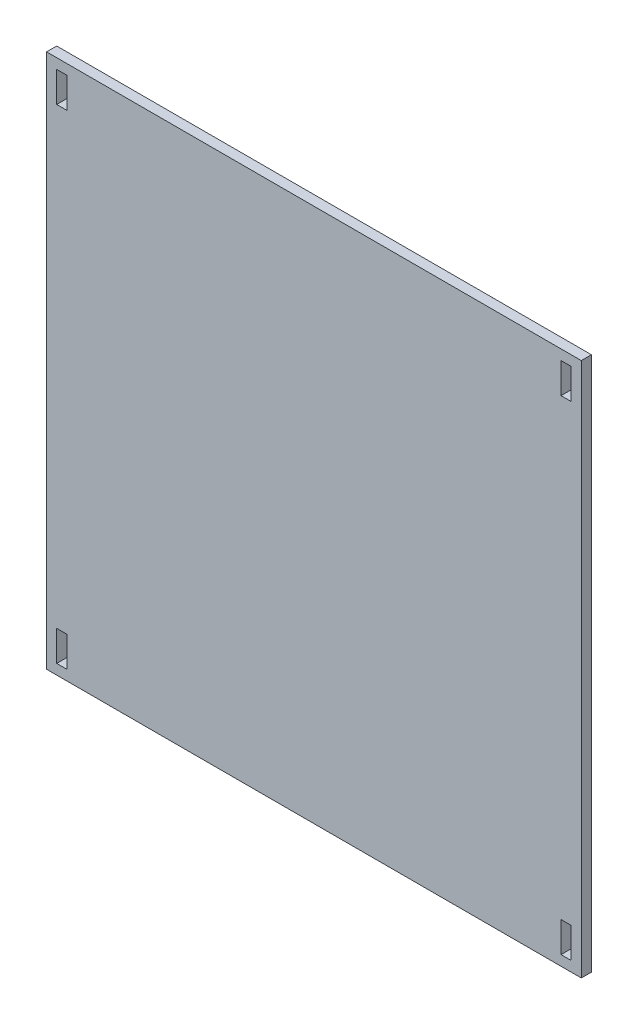
ISO-10303-21;
HEADER;
FILE_DESCRIPTION(('STEP AP214'),'2;1');
FILE_NAME('part.step','',(''),(''),'','','');
FILE_SCHEMA(('AUTOMOTIVE_DESIGN { 1 0 10303 214 1 1 1 1 }'));
ENDSEC;
DATA;
#1=APPLICATION_CONTEXT('core data for automotive mechanical design processes');
#2=APPLICATION_PROTOCOL_DEFINITION('international standard','automotive_design',2000,#1);
#3=PRODUCT_CONTEXT('',#1,'mechanical');
#4=PRODUCT('Part','Part','',(#3));
#5=PRODUCT_RELATED_PRODUCT_CATEGORY('part','',(#4));
#6=PRODUCT_DEFINITION_FORMATION('','',#4);
#7=PRODUCT_DEFINITION_CONTEXT('part definition',#1,'design');
#8=PRODUCT_DEFINITION('design','',#6,#7);
#9=PRODUCT_DEFINITION_SHAPE('','',#8);
#10=(LENGTH_UNIT() NAMED_UNIT(*) SI_UNIT(.MILLI.,.METRE.));
#11=(NAMED_UNIT(*) PLANE_ANGLE_UNIT() SI_UNIT($,.RADIAN.));
#12=(NAMED_UNIT(*) SI_UNIT($,.STERADIAN.) SOLID_ANGLE_UNIT());
#13=UNCERTAINTY_MEASURE_WITH_UNIT(LENGTH_MEASURE(1.E-05),#10,'distance_accuracy_value','');
#14=(GEOMETRIC_REPRESENTATION_CONTEXT(3) GLOBAL_UNCERTAINTY_ASSIGNED_CONTEXT((#13)) GLOBAL_UNIT_ASSIGNED_CONTEXT((#10,
#11,#12)) REPRESENTATION_CONTEXT('',''));
#15=CARTESIAN_POINT('',(0.,0.,0.));
#16=DIRECTION('',(0.,0.,1.));
#17=DIRECTION('',(1.,0.,0.));
#18=AXIS2_PLACEMENT_3D('',#15,#16,#17);
#19=CARTESIAN_POINT('',(0.,0.,10.));
#20=DIRECTION('',(-1.,0.,0.));
#21=DIRECTION('',(0.,0.,1.));
#22=AXIS2_PLACEMENT_3D('',#19,#20,#21);
#23=PLANE('',#22);
#24=DIRECTION('',(0.,1.,0.));
#25=VECTOR('',#24,1.);
#26=CARTESIAN_POINT('',(0.,0.,0.));
#27=LINE('',#26,#25);
#28=CARTESIAN_POINT('',(0.,0.,0.));
#29=VERTEX_POINT('',#28);
#30=CARTESIAN_POINT('',(0.,528.,0.));
#31=VERTEX_POINT('',#30);
#32=EDGE_CURVE('E298',#29,#31,#27,.T.);
#33=ORIENTED_EDGE('',*,*,#32,.T.);
#34=DIRECTION('',(0.,0.,-1.));
#35=VECTOR('',#34,1.);
#36=CARTESIAN_POINT('',(0.,528.,10.));
#37=LINE('',#36,#35);
#38=CARTESIAN_POINT('',(0.,528.,10.));
#39=VERTEX_POINT('',#38);
#40=EDGE_CURVE('E11',#39,#31,#37,.T.);
#41=ORIENTED_EDGE('',*,*,#40,.F.);
#42=DIRECTION('',(0.,1.,0.));
#43=VECTOR('',#42,1.);
#44=CARTESIAN_POINT('',(0.,0.,10.));
#45=LINE('',#44,#43);
#46=CARTESIAN_POINT('',(0.,0.,10.));
#47=VERTEX_POINT('',#46);
#48=EDGE_CURVE('E305',#47,#39,#45,.T.);
#49=ORIENTED_EDGE('',*,*,#48,.F.);
#50=DIRECTION('',(0.,0.,-1.));
#51=VECTOR('',#50,1.);
#52=CARTESIAN_POINT('',(0.,0.,10.));
#53=LINE('',#52,#51);
#54=EDGE_CURVE('E315',#47,#29,#53,.T.);
#55=ORIENTED_EDGE('',*,*,#54,.T.);
#56=EDGE_LOOP('',(#33,#41,#49,#55));
#57=FACE_BOUND('',#56,.T.);
#58=ADVANCED_FACE('F33',(#57),#23,.F.);
#59=CARTESIAN_POINT('',(0.,528.,10.));
#60=DIRECTION('',(0.,-1.,0.));
#61=DIRECTION('',(1.,0.,0.));
#62=AXIS2_PLACEMENT_3D('',#59,#60,#61);
#63=PLANE('',#62);
#64=DIRECTION('',(-1.,0.,0.));
#65=VECTOR('',#64,1.);
#66=CARTESIAN_POINT('',(0.,528.,0.));
#67=LINE('',#66,#65);
#68=CARTESIAN_POINT('',(-528.,528.,0.));
#69=VERTEX_POINT('',#68);
#70=EDGE_CURVE('E318',#31,#69,#67,.T.);
#71=ORIENTED_EDGE('',*,*,#70,.T.);
#72=DIRECTION('',(0.,0.,-1.));
#73=VECTOR('',#72,1.);
#74=CARTESIAN_POINT('',(-528.,528.,10.));
#75=LINE('',#74,#73);
#76=CARTESIAN_POINT('',(-528.,528.,10.));
#77=VERTEX_POINT('',#76);
#78=EDGE_CURVE('E40',#77,#69,#75,.T.);
#79=ORIENTED_EDGE('',*,*,#78,.F.);
#80=DIRECTION('',(-1.,0.,0.));
#81=VECTOR('',#80,1.);
#82=CARTESIAN_POINT('',(0.,528.,10.));
#83=LINE('',#82,#81);
#84=EDGE_CURVE('E308',#39,#77,#83,.T.);
#85=ORIENTED_EDGE('',*,*,#84,.F.);
#86=ORIENTED_EDGE('',*,*,#40,.T.);
#87=EDGE_LOOP('',(#71,#79,#85,#86));
#88=FACE_BOUND('',#87,.T.);
#89=ADVANCED_FACE('F347',(#88),#63,.F.);
#90=CARTESIAN_POINT('',(-528.,0.,10.));
#91=DIRECTION('',(1.,0.,0.));
#92=DIRECTION('',(0.,0.,-1.));
#93=AXIS2_PLACEMENT_3D('',#90,#91,#92);
#94=PLANE('',#93);
#95=DIRECTION('',(0.,-1.,0.));
#96=VECTOR('',#95,1.);
#97=CARTESIAN_POINT('',(-528.,0.,0.));
#98=LINE('',#97,#96);
#99=CARTESIAN_POINT('',(-528.,0.,0.));
#100=VERTEX_POINT('',#99);
#101=EDGE_CURVE('E320',#69,#100,#98,.T.);
#102=ORIENTED_EDGE('',*,*,#101,.T.);
#103=DIRECTION('',(0.,0.,-1.));
#104=VECTOR('',#103,1.);
#105=CARTESIAN_POINT('',(-528.,0.,10.));
#106=LINE('',#105,#104);
#107=CARTESIAN_POINT('',(-528.,0.,10.));
#108=VERTEX_POINT('',#107);
#109=EDGE_CURVE('E325',#108,#100,#106,.T.);
#110=ORIENTED_EDGE('',*,*,#109,.F.);
#111=DIRECTION('',(0.,-1.,0.));
#112=VECTOR('',#111,1.);
#113=CARTESIAN_POINT('',(-528.,0.,10.));
#114=LINE('',#113,#112);
#115=EDGE_CURVE('E311',#77,#108,#114,.T.);
#116=ORIENTED_EDGE('',*,*,#115,.F.);
#117=ORIENTED_EDGE('',*,*,#78,.T.);
#118=EDGE_LOOP('',(#102,#110,#116,#117));
#119=FACE_BOUND('',#118,.T.);
#120=ADVANCED_FACE('F332',(#119),#94,.F.);
#121=CARTESIAN_POINT('',(0.,0.,10.));
#122=DIRECTION('',(0.,1.,0.));
#123=DIRECTION('',(0.,0.,1.));
#124=AXIS2_PLACEMENT_3D('',#121,#122,#123);
#125=PLANE('',#124);
#126=DIRECTION('',(1.,0.,0.));
#127=VECTOR('',#126,1.);
#128=CARTESIAN_POINT('',(0.,0.,0.));
#129=LINE('',#128,#127);
#130=EDGE_CURVE('E309',#100,#29,#129,.T.);
#131=ORIENTED_EDGE('',*,*,#130,.T.);
#132=ORIENTED_EDGE('',*,*,#54,.F.);
#133=DIRECTION('',(1.,0.,0.));
#134=VECTOR('',#133,1.);
#135=CARTESIAN_POINT('',(0.,0.,10.));
#136=LINE('',#135,#134);
#137=EDGE_CURVE('E313',#108,#47,#136,.T.);
#138=ORIENTED_EDGE('',*,*,#137,.F.);
#139=ORIENTED_EDGE('',*,*,#109,.T.);
#140=EDGE_LOOP('',(#131,#132,#138,#139));
#141=FACE_BOUND('',#140,.T.);
#142=ADVANCED_FACE('F341',(#141),#125,.F.);
#143=CARTESIAN_POINT('',(0.,0.,10.));
#144=DIRECTION('',(0.,0.,1.));
#145=DIRECTION('',(1.,0.,0.));
#146=AXIS2_PLACEMENT_3D('',#143,#144,#145);
#147=PLANE('',#146);
#148=DIRECTION('',(0.,-1.,0.));
#149=VECTOR('',#148,1.);
#150=CARTESIAN_POINT('',(-10.,518.,10.));
#151=LINE('',#150,#149);
#152=CARTESIAN_POINT('',(-10.,518.,10.));
#153=VERTEX_POINT('',#152);
#154=CARTESIAN_POINT('',(-10.,488.,10.));
#155=VERTEX_POINT('',#154);
#156=EDGE_CURVE('E244',#153,#155,#151,.T.);
#157=ORIENTED_EDGE('',*,*,#156,.T.);
#158=DIRECTION('',(-1.,0.,0.));
#159=VECTOR('',#158,1.);
#160=CARTESIAN_POINT('',(-10.,488.,10.));
#161=LINE('',#160,#159);
#162=CARTESIAN_POINT('',(-20.,488.,10.));
#163=VERTEX_POINT('',#162);
#164=EDGE_CURVE('E247',#155,#163,#161,.T.);
#165=ORIENTED_EDGE('',*,*,#164,.T.);
#166=DIRECTION('',(0.,1.,0.));
#167=VECTOR('',#166,1.);
#168=CARTESIAN_POINT('',(-20.,518.,10.));
#169=LINE('',#168,#167);
#170=CARTESIAN_POINT('',(-20.,518.,10.));
#171=VERTEX_POINT('',#170);
#172=EDGE_CURVE('E47',#163,#171,#169,.T.);
#173=ORIENTED_EDGE('',*,*,#172,.T.);
#174=DIRECTION('',(1.,0.,0.));
#175=VECTOR('',#174,1.);
#176=CARTESIAN_POINT('',(-10.,518.,10.));
#177=LINE('',#176,#175);
#178=EDGE_CURVE('E252',#171,#153,#177,.T.);
#179=ORIENTED_EDGE('',*,*,#178,.T.);
#180=EDGE_LOOP('',(#157,#165,#173,#179));
#181=FACE_BOUND('',#180,.T.);
#182=DIRECTION('',(0.,-1.,0.));
#183=VECTOR('',#182,1.);
#184=CARTESIAN_POINT('',(-10.,10.,10.));
#185=LINE('',#184,#183);
#186=CARTESIAN_POINT('',(-10.,40.,10.));
#187=VERTEX_POINT('',#186);
#188=CARTESIAN_POINT('',(-10.,10.,10.));
#189=VERTEX_POINT('',#188);
#190=EDGE_CURVE('E214',#187,#189,#185,.T.);
#191=ORIENTED_EDGE('',*,*,#190,.T.);
#192=DIRECTION('',(-1.,0.,0.));
#193=VECTOR('',#192,1.);
#194=CARTESIAN_POINT('',(-10.,10.,10.));
#195=LINE('',#194,#193);
#196=CARTESIAN_POINT('',(-20.,10.,10.));
#197=VERTEX_POINT('',#196);
#198=EDGE_CURVE('E217',#189,#197,#195,.T.);
#199=ORIENTED_EDGE('',*,*,#198,.T.);
#200=DIRECTION('',(0.,1.,0.));
#201=VECTOR('',#200,1.);
#202=CARTESIAN_POINT('',(-20.,10.,10.));
#203=LINE('',#202,#201);
#204=CARTESIAN_POINT('',(-20.,40.,10.));
#205=VERTEX_POINT('',#204);
#206=EDGE_CURVE('E55',#197,#205,#203,.T.);
#207=ORIENTED_EDGE('',*,*,#206,.T.);
#208=DIRECTION('',(1.,0.,0.));
#209=VECTOR('',#208,1.);
#210=CARTESIAN_POINT('',(-10.,40.,10.));
#211=LINE('',#210,#209);
#212=EDGE_CURVE('E222',#205,#187,#211,.T.);
#213=ORIENTED_EDGE('',*,*,#212,.T.);
#214=EDGE_LOOP('',(#191,#199,#207,#213));
#215=FACE_BOUND('',#214,.T.);
#216=DIRECTION('',(0.,1.,0.));
#217=VECTOR('',#216,1.);
#218=CARTESIAN_POINT('',(-518.,40.,10.));
#219=LINE('',#218,#217);
#220=CARTESIAN_POINT('',(-518.,10.,10.));
#221=VERTEX_POINT('',#220);
#222=CARTESIAN_POINT('',(-518.,40.,10.));
#223=VERTEX_POINT('',#222);
#224=EDGE_CURVE('E173',#221,#223,#219,.T.);
#225=ORIENTED_EDGE('',*,*,#224,.T.);
#226=DIRECTION('',(1.,0.,0.));
#227=VECTOR('',#226,1.);
#228=CARTESIAN_POINT('',(-518.,40.,10.));
#229=LINE('',#228,#227);
#230=CARTESIAN_POINT('',(-508.,40.,10.));
#231=VERTEX_POINT('',#230);
#232=EDGE_CURVE('E185',#223,#231,#229,.T.);
#233=ORIENTED_EDGE('',*,*,#232,.T.);
#234=DIRECTION('',(0.,-1.,0.));
#235=VECTOR('',#234,1.);
#236=CARTESIAN_POINT('',(-508.,40.,10.));
#237=LINE('',#236,#235);
#238=CARTESIAN_POINT('',(-508.,10.,10.));
#239=VERTEX_POINT('',#238);
#240=EDGE_CURVE('E189',#231,#239,#237,.T.);
#241=ORIENTED_EDGE('',*,*,#240,.T.);
#242=DIRECTION('',(-1.,0.,0.));
#243=VECTOR('',#242,1.);
#244=CARTESIAN_POINT('',(-518.,10.,10.));
#245=LINE('',#244,#243);
#246=EDGE_CURVE('E181',#239,#221,#245,.T.);
#247=ORIENTED_EDGE('',*,*,#246,.T.);
#248=EDGE_LOOP('',(#225,#233,#241,#247));
#249=FACE_BOUND('',#248,.T.);
#250=DIRECTION('',(0.,1.,0.));
#251=VECTOR('',#250,1.);
#252=CARTESIAN_POINT('',(-518.,518.,10.));
#253=LINE('',#252,#251);
#254=CARTESIAN_POINT('',(-518.,488.,10.));
#255=VERTEX_POINT('',#254);
#256=CARTESIAN_POINT('',(-518.,518.,10.));
#257=VERTEX_POINT('',#256);
#258=EDGE_CURVE('E273',#255,#257,#253,.T.);
#259=ORIENTED_EDGE('',*,*,#258,.T.);
#260=DIRECTION('',(1.,0.,0.));
#261=VECTOR('',#260,1.);
#262=CARTESIAN_POINT('',(-518.,518.,10.));
#263=LINE('',#262,#261);
#264=CARTESIAN_POINT('',(-508.,518.,10.));
#265=VERTEX_POINT('',#264);
#266=EDGE_CURVE('E276',#257,#265,#263,.T.);
#267=ORIENTED_EDGE('',*,*,#266,.T.);
#268=DIRECTION('',(0.,-1.,0.));
#269=VECTOR('',#268,1.);
#270=CARTESIAN_POINT('',(-508.,518.,10.));
#271=LINE('',#270,#269);
#272=CARTESIAN_POINT('',(-508.,488.,10.));
#273=VERTEX_POINT('',#272);
#274=EDGE_CURVE('E280',#265,#273,#271,.T.);
#275=ORIENTED_EDGE('',*,*,#274,.T.);
#276=DIRECTION('',(-1.,0.,0.));
#277=VECTOR('',#276,1.);
#278=CARTESIAN_POINT('',(-518.,488.,10.));
#279=LINE('',#278,#277);
#280=EDGE_CURVE('E283',#273,#255,#279,.T.);
#281=ORIENTED_EDGE('',*,*,#280,.T.);
#282=EDGE_LOOP('',(#259,#267,#275,#281));
#283=FACE_BOUND('',#282,.T.);
#284=ORIENTED_EDGE('',*,*,#48,.T.);
#285=ORIENTED_EDGE('',*,*,#84,.T.);
#286=ORIENTED_EDGE('',*,*,#115,.T.);
#287=ORIENTED_EDGE('',*,*,#137,.T.);
#288=EDGE_LOOP('',(#284,#285,#286,#287));
#289=FACE_BOUND('',#288,.T.);
#290=ADVANCED_FACE('F191',(#181,#215,#249,#283,#289),#147,.T.);
#291=CARTESIAN_POINT('',(0.,0.,0.));
#292=DIRECTION('',(0.,0.,1.));
#293=DIRECTION('',(1.,0.,0.));
#294=AXIS2_PLACEMENT_3D('',#291,#292,#293);
#295=PLANE('',#294);
#296=DIRECTION('',(-1.,0.,0.));
#297=VECTOR('',#296,1.);
#298=CARTESIAN_POINT('',(-10.,488.,0.));
#299=LINE('',#298,#297);
#300=CARTESIAN_POINT('',(-10.,488.,0.));
#301=VERTEX_POINT('',#300);
#302=CARTESIAN_POINT('',(-20.,488.,0.));
#303=VERTEX_POINT('',#302);
#304=EDGE_CURVE('E258',#301,#303,#299,.T.);
#305=ORIENTED_EDGE('',*,*,#304,.F.);
#306=DIRECTION('',(0.,-1.,0.));
#307=VECTOR('',#306,1.);
#308=CARTESIAN_POINT('',(-10.,518.,0.));
#309=LINE('',#308,#307);
#310=CARTESIAN_POINT('',(-10.,518.,0.));
#311=VERTEX_POINT('',#310);
#312=EDGE_CURVE('E256',#311,#301,#309,.T.);
#313=ORIENTED_EDGE('',*,*,#312,.F.);
#314=DIRECTION('',(1.,0.,0.));
#315=VECTOR('',#314,1.);
#316=CARTESIAN_POINT('',(-10.,518.,0.));
#317=LINE('',#316,#315);
#318=CARTESIAN_POINT('',(-20.,518.,0.));
#319=VERTEX_POINT('',#318);
#320=EDGE_CURVE('E248',#319,#311,#317,.T.);
#321=ORIENTED_EDGE('',*,*,#320,.F.);
#322=DIRECTION('',(0.,1.,0.));
#323=VECTOR('',#322,1.);
#324=CARTESIAN_POINT('',(-20.,518.,0.));
#325=LINE('',#324,#323);
#326=EDGE_CURVE('E261',#303,#319,#325,.T.);
#327=ORIENTED_EDGE('',*,*,#326,.F.);
#328=EDGE_LOOP('',(#305,#313,#321,#327));
#329=FACE_BOUND('',#328,.T.);
#330=DIRECTION('',(-1.,0.,0.));
#331=VECTOR('',#330,1.);
#332=CARTESIAN_POINT('',(-10.,10.,0.));
#333=LINE('',#332,#331);
#334=CARTESIAN_POINT('',(-10.,10.,0.));
#335=VERTEX_POINT('',#334);
#336=CARTESIAN_POINT('',(-20.,10.,0.));
#337=VERTEX_POINT('',#336);
#338=EDGE_CURVE('E228',#335,#337,#333,.T.);
#339=ORIENTED_EDGE('',*,*,#338,.F.);
#340=DIRECTION('',(0.,-1.,0.));
#341=VECTOR('',#340,1.);
#342=CARTESIAN_POINT('',(-10.,10.,0.));
#343=LINE('',#342,#341);
#344=CARTESIAN_POINT('',(-10.,40.,0.));
#345=VERTEX_POINT('',#344);
#346=EDGE_CURVE('E226',#345,#335,#343,.T.);
#347=ORIENTED_EDGE('',*,*,#346,.F.);
#348=DIRECTION('',(1.,0.,0.));
#349=VECTOR('',#348,1.);
#350=CARTESIAN_POINT('',(-10.,40.,0.));
#351=LINE('',#350,#349);
#352=CARTESIAN_POINT('',(-20.,40.,0.));
#353=VERTEX_POINT('',#352);
#354=EDGE_CURVE('E218',#353,#345,#351,.T.);
#355=ORIENTED_EDGE('',*,*,#354,.F.);
#356=DIRECTION('',(0.,1.,0.));
#357=VECTOR('',#356,1.);
#358=CARTESIAN_POINT('',(-20.,10.,0.));
#359=LINE('',#358,#357);
#360=EDGE_CURVE('E232',#337,#353,#359,.T.);
#361=ORIENTED_EDGE('',*,*,#360,.F.);
#362=EDGE_LOOP('',(#339,#347,#355,#361));
#363=FACE_BOUND('',#362,.T.);
#364=DIRECTION('',(1.,0.,0.));
#365=VECTOR('',#364,1.);
#366=CARTESIAN_POINT('',(-518.,40.,0.));
#367=LINE('',#366,#365);
#368=CARTESIAN_POINT('',(-518.,40.,0.));
#369=VERTEX_POINT('',#368);
#370=CARTESIAN_POINT('',(-508.,40.,0.));
#371=VERTEX_POINT('',#370);
#372=EDGE_CURVE('E203',#369,#371,#367,.T.);
#373=ORIENTED_EDGE('',*,*,#372,.F.);
#374=DIRECTION('',(0.,1.,0.));
#375=VECTOR('',#374,1.);
#376=CARTESIAN_POINT('',(-518.,40.,0.));
#377=LINE('',#376,#375);
#378=CARTESIAN_POINT('',(-518.,10.,0.));
#379=VERTEX_POINT('',#378);
#380=EDGE_CURVE('E176',#379,#369,#377,.T.);
#381=ORIENTED_EDGE('',*,*,#380,.F.);
#382=DIRECTION('',(-1.,0.,0.));
#383=VECTOR('',#382,1.);
#384=CARTESIAN_POINT('',(-518.,10.,0.));
#385=LINE('',#384,#383);
#386=CARTESIAN_POINT('',(-508.,10.,0.));
#387=VERTEX_POINT('',#386);
#388=EDGE_CURVE('E194',#387,#379,#385,.T.);
#389=ORIENTED_EDGE('',*,*,#388,.F.);
#390=DIRECTION('',(0.,-1.,0.));
#391=VECTOR('',#390,1.);
#392=CARTESIAN_POINT('',(-508.,40.,0.));
#393=LINE('',#392,#391);
#394=EDGE_CURVE('E197',#371,#387,#393,.T.);
#395=ORIENTED_EDGE('',*,*,#394,.F.);
#396=EDGE_LOOP('',(#373,#381,#389,#395));
#397=FACE_BOUND('',#396,.T.);
#398=DIRECTION('',(1.,0.,0.));
#399=VECTOR('',#398,1.);
#400=CARTESIAN_POINT('',(-518.,518.,0.));
#401=LINE('',#400,#399);
#402=CARTESIAN_POINT('',(-518.,518.,0.));
#403=VERTEX_POINT('',#402);
#404=CARTESIAN_POINT('',(-508.,518.,0.));
#405=VERTEX_POINT('',#404);
#406=EDGE_CURVE('E288',#403,#405,#401,.T.);
#407=ORIENTED_EDGE('',*,*,#406,.F.);
#408=DIRECTION('',(0.,1.,0.));
#409=VECTOR('',#408,1.);
#410=CARTESIAN_POINT('',(-518.,518.,0.));
#411=LINE('',#410,#409);
#412=CARTESIAN_POINT('',(-518.,488.,0.));
#413=VERTEX_POINT('',#412);
#414=EDGE_CURVE('E210',#413,#403,#411,.T.);
#415=ORIENTED_EDGE('',*,*,#414,.F.);
#416=DIRECTION('',(-1.,0.,0.));
#417=VECTOR('',#416,1.);
#418=CARTESIAN_POINT('',(-518.,488.,0.));
#419=LINE('',#418,#417);
#420=CARTESIAN_POINT('',(-508.,488.,0.));
#421=VERTEX_POINT('',#420);
#422=EDGE_CURVE('E277',#421,#413,#419,.T.);
#423=ORIENTED_EDGE('',*,*,#422,.F.);
#424=DIRECTION('',(0.,-1.,0.));
#425=VECTOR('',#424,1.);
#426=CARTESIAN_POINT('',(-508.,518.,0.));
#427=LINE('',#426,#425);
#428=EDGE_CURVE('E291',#405,#421,#427,.T.);
#429=ORIENTED_EDGE('',*,*,#428,.F.);
#430=EDGE_LOOP('',(#407,#415,#423,#429));
#431=FACE_BOUND('',#430,.T.);
#432=ORIENTED_EDGE('',*,*,#32,.F.);
#433=ORIENTED_EDGE('',*,*,#130,.F.);
#434=ORIENTED_EDGE('',*,*,#101,.F.);
#435=ORIENTED_EDGE('',*,*,#70,.F.);
#436=EDGE_LOOP('',(#432,#433,#434,#435));
#437=FACE_BOUND('',#436,.T.);
#438=ADVANCED_FACE('F338',(#329,#363,#397,#431,#437),#295,.F.);
#439=CARTESIAN_POINT('',(-518.,518.,10.));
#440=DIRECTION('',(-1.,0.,0.));
#441=DIRECTION('',(0.,0.,1.));
#442=AXIS2_PLACEMENT_3D('',#439,#440,#441);
#443=PLANE('',#442);
#444=ORIENTED_EDGE('',*,*,#414,.T.);
#445=DIRECTION('',(0.,0.,-1.));
#446=VECTOR('',#445,1.);
#447=CARTESIAN_POINT('',(-518.,518.,10.));
#448=LINE('',#447,#446);
#449=EDGE_CURVE('E286',#257,#403,#448,.T.);
#450=ORIENTED_EDGE('',*,*,#449,.F.);
#451=ORIENTED_EDGE('',*,*,#258,.F.);
#452=DIRECTION('',(0.,0.,-1.));
#453=VECTOR('',#452,1.);
#454=CARTESIAN_POINT('',(-518.,488.,10.));
#455=LINE('',#454,#453);
#456=EDGE_CURVE('E296',#255,#413,#455,.T.);
#457=ORIENTED_EDGE('',*,*,#456,.T.);
#458=EDGE_LOOP('',(#444,#450,#451,#457));
#459=FACE_BOUND('',#458,.T.);
#460=ADVANCED_FACE('F359',(#459),#443,.F.);
#461=CARTESIAN_POINT('',(-518.,488.,10.));
#462=DIRECTION('',(0.,-1.,0.));
#463=DIRECTION('',(0.,0.,-1.));
#464=AXIS2_PLACEMENT_3D('',#461,#462,#463);
#465=PLANE('',#464);
#466=ORIENTED_EDGE('',*,*,#422,.T.);
#467=ORIENTED_EDGE('',*,*,#456,.F.);
#468=ORIENTED_EDGE('',*,*,#280,.F.);
#469=DIRECTION('',(0.,0.,-1.));
#470=VECTOR('',#469,1.);
#471=CARTESIAN_POINT('',(-508.,488.,10.));
#472=LINE('',#471,#470);
#473=EDGE_CURVE('E299',#273,#421,#472,.T.);
#474=ORIENTED_EDGE('',*,*,#473,.T.);
#475=EDGE_LOOP('',(#466,#467,#468,#474));
#476=FACE_BOUND('',#475,.T.);
#477=ADVANCED_FACE('F366',(#476),#465,.F.);
#478=CARTESIAN_POINT('',(-508.,518.,10.));
#479=DIRECTION('',(1.,0.,0.));
#480=DIRECTION('',(0.,0.,-1.));
#481=AXIS2_PLACEMENT_3D('',#478,#479,#480);
#482=PLANE('',#481);
#483=ORIENTED_EDGE('',*,*,#428,.T.);
#484=ORIENTED_EDGE('',*,*,#473,.F.);
#485=ORIENTED_EDGE('',*,*,#274,.F.);
#486=DIRECTION('',(0.,0.,-1.));
#487=VECTOR('',#486,1.);
#488=CARTESIAN_POINT('',(-508.,518.,10.));
#489=LINE('',#488,#487);
#490=EDGE_CURVE('E301',#265,#405,#489,.T.);
#491=ORIENTED_EDGE('',*,*,#490,.T.);
#492=EDGE_LOOP('',(#483,#484,#485,#491));
#493=FACE_BOUND('',#492,.T.);
#494=ADVANCED_FACE('F371',(#493),#482,.F.);
#495=CARTESIAN_POINT('',(-518.,518.,10.));
#496=DIRECTION('',(0.,1.,0.));
#497=DIRECTION('',(0.,0.,1.));
#498=AXIS2_PLACEMENT_3D('',#495,#496,#497);
#499=PLANE('',#498);
#500=ORIENTED_EDGE('',*,*,#406,.T.);
#501=ORIENTED_EDGE('',*,*,#490,.F.);
#502=ORIENTED_EDGE('',*,*,#266,.F.);
#503=ORIENTED_EDGE('',*,*,#449,.T.);
#504=EDGE_LOOP('',(#500,#501,#502,#503));
#505=FACE_BOUND('',#504,.T.);
#506=ADVANCED_FACE('F368',(#505),#499,.F.);
#507=CARTESIAN_POINT('',(-518.,40.,10.));
#508=DIRECTION('',(-1.,0.,0.));
#509=DIRECTION('',(0.,0.,1.));
#510=AXIS2_PLACEMENT_3D('',#507,#508,#509);
#511=PLANE('',#510);
#512=ORIENTED_EDGE('',*,*,#380,.T.);
#513=DIRECTION('',(0.,0.,-1.));
#514=VECTOR('',#513,1.);
#515=CARTESIAN_POINT('',(-518.,40.,10.));
#516=LINE('',#515,#514);
#517=EDGE_CURVE('E169',#223,#369,#516,.T.);
#518=ORIENTED_EDGE('',*,*,#517,.F.);
#519=ORIENTED_EDGE('',*,*,#224,.F.);
#520=DIRECTION('',(0.,0.,-1.));
#521=VECTOR('',#520,1.);
#522=CARTESIAN_POINT('',(-518.,10.,10.));
#523=LINE('',#522,#521);
#524=EDGE_CURVE('E208',#221,#379,#523,.T.);
#525=ORIENTED_EDGE('',*,*,#524,.T.);
#526=EDGE_LOOP('',(#512,#518,#519,#525));
#527=FACE_BOUND('',#526,.T.);
#528=ADVANCED_FACE('F171',(#527),#511,.F.);
#529=CARTESIAN_POINT('',(-518.,10.,10.));
#530=DIRECTION('',(0.,-1.,0.));
#531=DIRECTION('',(1.,0.,0.));
#532=AXIS2_PLACEMENT_3D('',#529,#530,#531);
#533=PLANE('',#532);
#534=ORIENTED_EDGE('',*,*,#388,.T.);
#535=ORIENTED_EDGE('',*,*,#524,.F.);
#536=ORIENTED_EDGE('',*,*,#246,.F.);
#537=DIRECTION('',(0.,0.,-1.));
#538=VECTOR('',#537,1.);
#539=CARTESIAN_POINT('',(-508.,10.,10.));
#540=LINE('',#539,#538);
#541=EDGE_CURVE('E211',#239,#387,#540,.T.);
#542=ORIENTED_EDGE('',*,*,#541,.T.);
#543=EDGE_LOOP('',(#534,#535,#536,#542));
#544=FACE_BOUND('',#543,.T.);
#545=ADVANCED_FACE('F411',(#544),#533,.F.);
#546=CARTESIAN_POINT('',(-508.,40.,10.));
#547=DIRECTION('',(1.,0.,0.));
#548=DIRECTION('',(0.,0.,-1.));
#549=AXIS2_PLACEMENT_3D('',#546,#547,#548);
#550=PLANE('',#549);
#551=ORIENTED_EDGE('',*,*,#394,.T.);
#552=ORIENTED_EDGE('',*,*,#541,.F.);
#553=ORIENTED_EDGE('',*,*,#240,.F.);
#554=DIRECTION('',(0.,0.,-1.));
#555=VECTOR('',#554,1.);
#556=CARTESIAN_POINT('',(-508.,40.,10.));
#557=LINE('',#556,#555);
#558=EDGE_CURVE('E180',#231,#371,#557,.T.);
#559=ORIENTED_EDGE('',*,*,#558,.T.);
#560=EDGE_LOOP('',(#551,#552,#553,#559));
#561=FACE_BOUND('',#560,.T.);
#562=ADVANCED_FACE('F414',(#561),#550,.F.);
#563=CARTESIAN_POINT('',(-518.,40.,10.));
#564=DIRECTION('',(0.,1.,0.));
#565=DIRECTION('',(-1.,0.,0.));
#566=AXIS2_PLACEMENT_3D('',#563,#564,#565);
#567=PLANE('',#566);
#568=ORIENTED_EDGE('',*,*,#372,.T.);
#569=ORIENTED_EDGE('',*,*,#558,.F.);
#570=ORIENTED_EDGE('',*,*,#232,.F.);
#571=ORIENTED_EDGE('',*,*,#517,.T.);
#572=EDGE_LOOP('',(#568,#569,#570,#571));
#573=FACE_BOUND('',#572,.T.);
#574=ADVANCED_FACE('F186',(#573),#567,.F.);
#575=CARTESIAN_POINT('',(-10.,10.,10.));
#576=DIRECTION('',(1.,0.,0.));
#577=DIRECTION('',(0.,0.,-1.));
#578=AXIS2_PLACEMENT_3D('',#575,#576,#577);
#579=PLANE('',#578);
#580=ORIENTED_EDGE('',*,*,#346,.T.);
#581=DIRECTION('',(0.,0.,-1.));
#582=VECTOR('',#581,1.);
#583=CARTESIAN_POINT('',(-10.,10.,10.));
#584=LINE('',#583,#582);
#585=EDGE_CURVE('E225',#189,#335,#584,.T.);
#586=ORIENTED_EDGE('',*,*,#585,.F.);
#587=ORIENTED_EDGE('',*,*,#190,.F.);
#588=DIRECTION('',(0.,0.,-1.));
#589=VECTOR('',#588,1.);
#590=CARTESIAN_POINT('',(-10.,40.,10.));
#591=LINE('',#590,#589);
#592=EDGE_CURVE('E204',#187,#345,#591,.T.);
#593=ORIENTED_EDGE('',*,*,#592,.T.);
#594=EDGE_LOOP('',(#580,#586,#587,#593));
#595=FACE_BOUND('',#594,.T.);
#596=ADVANCED_FACE('F395',(#595),#579,.F.);
#597=CARTESIAN_POINT('',(-10.,40.,10.));
#598=DIRECTION('',(0.,1.,0.));
#599=DIRECTION('',(0.,0.,1.));
#600=AXIS2_PLACEMENT_3D('',#597,#598,#599);
#601=PLANE('',#600);
#602=ORIENTED_EDGE('',*,*,#354,.T.);
#603=ORIENTED_EDGE('',*,*,#592,.F.);
#604=ORIENTED_EDGE('',*,*,#212,.F.);
#605=DIRECTION('',(0.,0.,-1.));
#606=VECTOR('',#605,1.);
#607=CARTESIAN_POINT('',(-20.,40.,10.));
#608=LINE('',#607,#606);
#609=EDGE_CURVE('E238',#205,#353,#608,.T.);
#610=ORIENTED_EDGE('',*,*,#609,.T.);
#611=EDGE_LOOP('',(#602,#603,#604,#610));
#612=FACE_BOUND('',#611,.T.);
#613=ADVANCED_FACE('F398',(#612),#601,.F.);
#614=CARTESIAN_POINT('',(-20.,10.,10.));
#615=DIRECTION('',(-1.,0.,0.));
#616=DIRECTION('',(0.,-1.,0.));
#617=AXIS2_PLACEMENT_3D('',#614,#615,#616);
#618=PLANE('',#617);
#619=ORIENTED_EDGE('',*,*,#360,.T.);
#620=ORIENTED_EDGE('',*,*,#609,.F.);
#621=ORIENTED_EDGE('',*,*,#206,.F.);
#622=DIRECTION('',(0.,0.,-1.));
#623=VECTOR('',#622,1.);
#624=CARTESIAN_POINT('',(-20.,10.,10.));
#625=LINE('',#624,#623);
#626=EDGE_CURVE('E240',#197,#337,#625,.T.);
#627=ORIENTED_EDGE('',*,*,#626,.T.);
#628=EDGE_LOOP('',(#619,#620,#621,#627));
#629=FACE_BOUND('',#628,.T.);
#630=ADVANCED_FACE('F402',(#629),#618,.F.);
#631=CARTESIAN_POINT('',(-10.,10.,10.));
#632=DIRECTION('',(0.,-1.,0.));
#633=DIRECTION('',(0.,0.,-1.));
#634=AXIS2_PLACEMENT_3D('',#631,#632,#633);
#635=PLANE('',#634);
#636=ORIENTED_EDGE('',*,*,#338,.T.);
#637=ORIENTED_EDGE('',*,*,#626,.F.);
#638=ORIENTED_EDGE('',*,*,#198,.F.);
#639=ORIENTED_EDGE('',*,*,#585,.T.);
#640=EDGE_LOOP('',(#636,#637,#638,#639));
#641=FACE_BOUND('',#640,.T.);
#642=ADVANCED_FACE('F383',(#641),#635,.F.);
#643=CARTESIAN_POINT('',(-10.,518.,10.));
#644=DIRECTION('',(1.,0.,0.));
#645=DIRECTION('',(0.,1.,0.));
#646=AXIS2_PLACEMENT_3D('',#643,#644,#645);
#647=PLANE('',#646);
#648=ORIENTED_EDGE('',*,*,#312,.T.);
#649=DIRECTION('',(0.,0.,-1.));
#650=VECTOR('',#649,1.);
#651=CARTESIAN_POINT('',(-10.,488.,10.));
#652=LINE('',#651,#650);
#653=EDGE_CURVE('E255',#155,#301,#652,.T.);
#654=ORIENTED_EDGE('',*,*,#653,.F.);
#655=ORIENTED_EDGE('',*,*,#156,.F.);
#656=DIRECTION('',(0.,0.,-1.));
#657=VECTOR('',#656,1.);
#658=CARTESIAN_POINT('',(-10.,518.,10.));
#659=LINE('',#658,#657);
#660=EDGE_CURVE('E229',#153,#311,#659,.T.);
#661=ORIENTED_EDGE('',*,*,#660,.T.);
#662=EDGE_LOOP('',(#648,#654,#655,#661));
#663=FACE_BOUND('',#662,.T.);
#664=ADVANCED_FACE('F379',(#663),#647,.F.);
#665=CARTESIAN_POINT('',(-10.,518.,10.));
#666=DIRECTION('',(0.,1.,0.));
#667=DIRECTION('',(0.,0.,1.));
#668=AXIS2_PLACEMENT_3D('',#665,#666,#667);
#669=PLANE('',#668);
#670=ORIENTED_EDGE('',*,*,#320,.T.);
#671=ORIENTED_EDGE('',*,*,#660,.F.);
#672=ORIENTED_EDGE('',*,*,#178,.F.);
#673=DIRECTION('',(0.,0.,-1.));
#674=VECTOR('',#673,1.);
#675=CARTESIAN_POINT('',(-20.,518.,10.));
#676=LINE('',#675,#674);
#677=EDGE_CURVE('E267',#171,#319,#676,.T.);
#678=ORIENTED_EDGE('',*,*,#677,.T.);
#679=EDGE_LOOP('',(#670,#671,#672,#678));
#680=FACE_BOUND('',#679,.T.);
#681=ADVANCED_FACE('F382',(#680),#669,.F.);
#682=CARTESIAN_POINT('',(-20.,518.,10.));
#683=DIRECTION('',(-1.,0.,0.));
#684=DIRECTION('',(0.,-1.,0.));
#685=AXIS2_PLACEMENT_3D('',#682,#683,#684);
#686=PLANE('',#685);
#687=ORIENTED_EDGE('',*,*,#326,.T.);
#688=ORIENTED_EDGE('',*,*,#677,.F.);
#689=ORIENTED_EDGE('',*,*,#172,.F.);
#690=DIRECTION('',(0.,0.,-1.));
#691=VECTOR('',#690,1.);
#692=CARTESIAN_POINT('',(-20.,488.,10.));
#693=LINE('',#692,#691);
#694=EDGE_CURVE('E269',#163,#303,#693,.T.);
#695=ORIENTED_EDGE('',*,*,#694,.T.);
#696=EDGE_LOOP('',(#687,#688,#689,#695));
#697=FACE_BOUND('',#696,.T.);
#698=ADVANCED_FACE('F388',(#697),#686,.F.);
#699=CARTESIAN_POINT('',(-10.,488.,10.));
#700=DIRECTION('',(0.,-1.,0.));
#701=DIRECTION('',(0.,0.,-1.));
#702=AXIS2_PLACEMENT_3D('',#699,#700,#701);
#703=PLANE('',#702);
#704=ORIENTED_EDGE('',*,*,#304,.T.);
#705=ORIENTED_EDGE('',*,*,#694,.F.);
#706=ORIENTED_EDGE('',*,*,#164,.F.);
#707=ORIENTED_EDGE('',*,*,#653,.T.);
#708=EDGE_LOOP('',(#704,#705,#706,#707));
#709=FACE_BOUND('',#708,.T.);
#710=ADVANCED_FACE('F385',(#709),#703,.F.);
#711=CLOSED_SHELL('',(#58,#89,#120,#142,#290,#438,#460,#477,#494,#506,#528,#545,#562,#574,#596,
#613,#630,#642,#664,#681,#698,#710));
#712=MANIFOLD_SOLID_BREP('B2',#711);
#713=ADVANCED_BREP_SHAPE_REPRESENTATION('',(#18,#712),#14);
#714=SHAPE_DEFINITION_REPRESENTATION(#9,#713);
ENDSEC;
END-ISO-10303-21;
